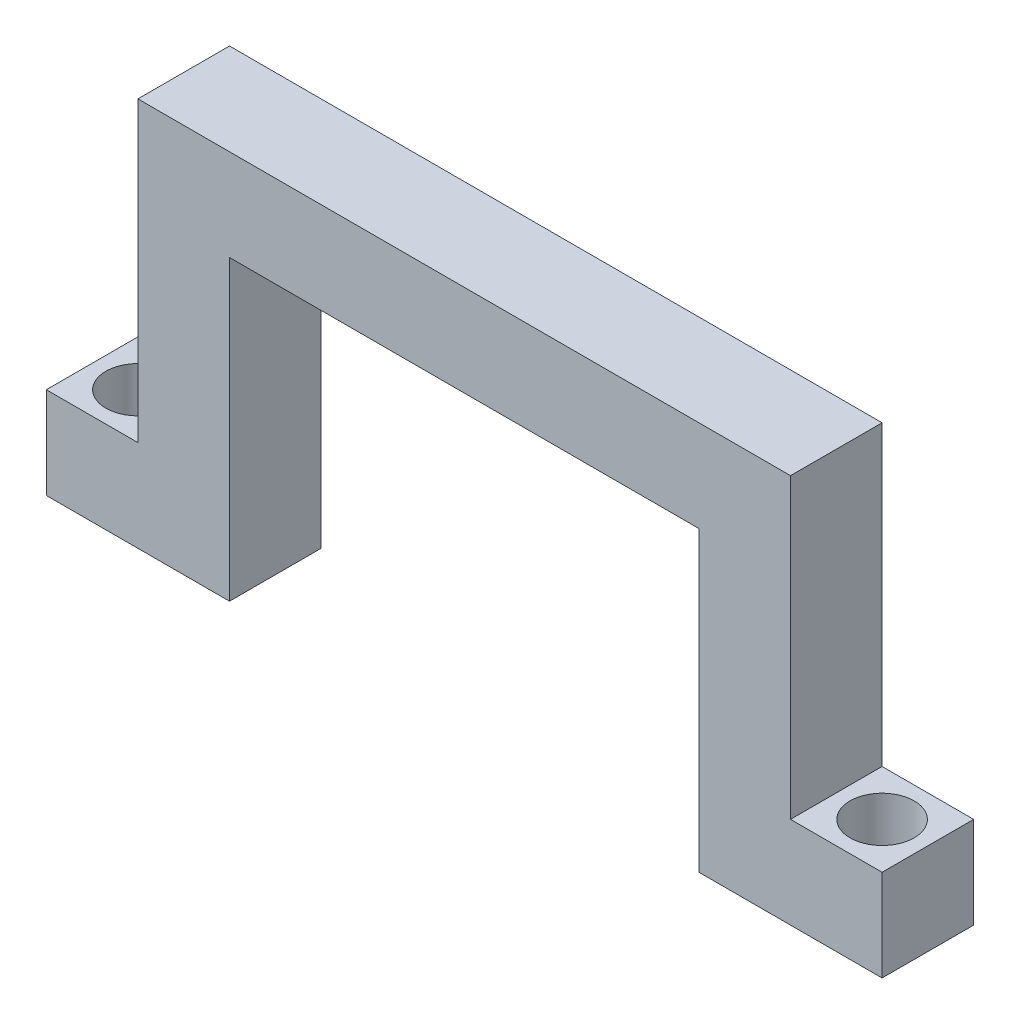
ISO-10303-21;
HEADER;
FILE_DESCRIPTION(('STEP AP214'),'2;1');
FILE_NAME('part.step','',(''),(''),'','','');
FILE_SCHEMA(('AUTOMOTIVE_DESIGN { 1 0 10303 214 1 1 1 1 }'));
ENDSEC;
DATA;
#1=APPLICATION_CONTEXT('core data for automotive mechanical design processes');
#2=APPLICATION_PROTOCOL_DEFINITION('international standard','automotive_design',2000,#1);
#3=PRODUCT_CONTEXT('',#1,'mechanical');
#4=PRODUCT('Part','Part','',(#3));
#5=PRODUCT_RELATED_PRODUCT_CATEGORY('part','',(#4));
#6=PRODUCT_DEFINITION_FORMATION('','',#4);
#7=PRODUCT_DEFINITION_CONTEXT('part definition',#1,'design');
#8=PRODUCT_DEFINITION('design','',#6,#7);
#9=PRODUCT_DEFINITION_SHAPE('','',#8);
#10=(LENGTH_UNIT() NAMED_UNIT(*) SI_UNIT(.MILLI.,.METRE.));
#11=(NAMED_UNIT(*) PLANE_ANGLE_UNIT() SI_UNIT($,.RADIAN.));
#12=(NAMED_UNIT(*) SI_UNIT($,.STERADIAN.) SOLID_ANGLE_UNIT());
#13=UNCERTAINTY_MEASURE_WITH_UNIT(LENGTH_MEASURE(1.E-05),#10,'distance_accuracy_value','');
#14=(GEOMETRIC_REPRESENTATION_CONTEXT(3) GLOBAL_UNCERTAINTY_ASSIGNED_CONTEXT((#13)) GLOBAL_UNIT_ASSIGNED_CONTEXT((#10,
#11,#12)) REPRESENTATION_CONTEXT('',''));
#15=CARTESIAN_POINT('',(0.,0.,0.));
#16=DIRECTION('',(0.,0.,1.));
#17=DIRECTION('',(1.,0.,0.));
#18=AXIS2_PLACEMENT_3D('',#15,#16,#17);
#19=CARTESIAN_POINT('',(13.4215909090909,21.59,0.));
#20=DIRECTION('',(-1.,0.,0.));
#21=DIRECTION('',(0.,0.,1.));
#22=AXIS2_PLACEMENT_3D('',#19,#20,#21);
#23=PLANE('',#22);
#24=DIRECTION('',(0.,0.,1.));
#25=VECTOR('',#24,1.);
#26=CARTESIAN_POINT('',(13.4215909090909,5.08,0.));
#27=LINE('',#26,#25);
#28=CARTESIAN_POINT('',(13.4215909090909,5.08,0.));
#29=VERTEX_POINT('',#28);
#30=CARTESIAN_POINT('',(13.4215909090909,5.08,5.08));
#31=VERTEX_POINT('',#30);
#32=EDGE_CURVE('E50',#29,#31,#27,.T.);
#33=ORIENTED_EDGE('',*,*,#32,.F.);
#34=DIRECTION('',(0.,-1.,0.));
#35=VECTOR('',#34,1.);
#36=CARTESIAN_POINT('',(13.4215909090909,21.59,0.));
#37=LINE('',#36,#35);
#38=CARTESIAN_POINT('',(13.4215909090909,21.59,0.));
#39=VERTEX_POINT('',#38);
#40=EDGE_CURVE('E212',#39,#29,#37,.T.);
#41=ORIENTED_EDGE('',*,*,#40,.F.);
#42=DIRECTION('',(0.,0.,-1.));
#43=VECTOR('',#42,1.);
#44=CARTESIAN_POINT('',(13.4215909090909,21.59,0.));
#45=LINE('',#44,#43);
#46=CARTESIAN_POINT('',(13.4215909090909,21.59,5.08));
#47=VERTEX_POINT('',#46);
#48=EDGE_CURVE('E202',#47,#39,#45,.T.);
#49=ORIENTED_EDGE('',*,*,#48,.F.);
#50=DIRECTION('',(0.,-1.,0.));
#51=VECTOR('',#50,1.);
#52=CARTESIAN_POINT('',(13.4215909090909,21.59,5.08));
#53=LINE('',#52,#51);
#54=EDGE_CURVE('E214',#47,#31,#53,.T.);
#55=ORIENTED_EDGE('',*,*,#54,.T.);
#56=EDGE_LOOP('',(#33,#41,#49,#55));
#57=FACE_BOUND('',#56,.T.);
#58=ADVANCED_FACE('F33',(#57),#23,.F.);
#59=CARTESIAN_POINT('',(0.,0.,0.));
#60=DIRECTION('',(0.,1.,0.));
#61=DIRECTION('',(0.,0.,1.));
#62=AXIS2_PLACEMENT_3D('',#59,#60,#61);
#63=PLANE('',#62);
#64=CARTESIAN_POINT('',(15.9615909090909,0.,2.54));
#65=DIRECTION('',(0.,1.,0.));
#66=DIRECTION('',(0.,0.,-1.));
#67=AXIS2_PLACEMENT_3D('',#64,#65,#66);
#68=CIRCLE('',#67,1.778);
#69=CARTESIAN_POINT('',(15.9615909090909,0.,0.762000000000001));
#70=VERTEX_POINT('',#69);
#71=EDGE_CURVE('E226',#70,#70,#68,.T.);
#72=ORIENTED_EDGE('',*,*,#71,.T.);
#73=EDGE_LOOP('',(#72));
#74=FACE_BOUND('',#73,.T.);
#75=DIRECTION('',(0.,0.,1.));
#76=VECTOR('',#75,1.);
#77=CARTESIAN_POINT('',(8.34159090909091,0.,0.));
#78=LINE('',#77,#76);
#79=CARTESIAN_POINT('',(8.34159090909091,0.,0.));
#80=VERTEX_POINT('',#79);
#81=CARTESIAN_POINT('',(8.34159090909091,0.,5.08));
#82=VERTEX_POINT('',#81);
#83=EDGE_CURVE('E42',#80,#82,#78,.T.);
#84=ORIENTED_EDGE('',*,*,#83,.F.);
#85=DIRECTION('',(-1.,0.,0.));
#86=VECTOR('',#85,1.);
#87=CARTESIAN_POINT('',(-22.7734090909091,0.,0.));
#88=LINE('',#87,#86);
#89=CARTESIAN_POINT('',(18.5015909090909,0.,0.));
#90=VERTEX_POINT('',#89);
#91=EDGE_CURVE('E127',#90,#80,#88,.T.);
#92=ORIENTED_EDGE('',*,*,#91,.F.);
#93=DIRECTION('',(0.,0.,1.));
#94=VECTOR('',#93,1.);
#95=CARTESIAN_POINT('',(18.5015909090909,0.,0.));
#96=LINE('',#95,#94);
#97=CARTESIAN_POINT('',(18.5015909090909,0.,5.08));
#98=VERTEX_POINT('',#97);
#99=EDGE_CURVE('E132',#90,#98,#96,.T.);
#100=ORIENTED_EDGE('',*,*,#99,.T.);
#101=DIRECTION('',(1.,0.,0.));
#102=VECTOR('',#101,1.);
#103=CARTESIAN_POINT('',(-22.7734090909091,0.,5.08));
#104=LINE('',#103,#102);
#105=EDGE_CURVE('E197',#82,#98,#104,.T.);
#106=ORIENTED_EDGE('',*,*,#105,.F.);
#107=EDGE_LOOP('',(#84,#92,#100,#106));
#108=FACE_BOUND('',#107,.T.);
#109=ADVANCED_FACE('F129',(#74,#108),#63,.F.);
#110=CARTESIAN_POINT('',(-22.7734090909091,21.59,0.));
#111=DIRECTION('',(1.,0.,0.));
#112=DIRECTION('',(0.,0.,-1.));
#113=AXIS2_PLACEMENT_3D('',#110,#111,#112);
#114=PLANE('',#113);
#115=DIRECTION('',(0.,-1.,0.));
#116=VECTOR('',#115,1.);
#117=CARTESIAN_POINT('',(-22.7734090909091,21.59,0.));
#118=LINE('',#117,#116);
#119=CARTESIAN_POINT('',(-22.7734090909091,21.59,0.));
#120=VERTEX_POINT('',#119);
#121=CARTESIAN_POINT('',(-22.7734090909091,5.08,0.));
#122=VERTEX_POINT('',#121);
#123=EDGE_CURVE('E206',#120,#122,#118,.T.);
#124=ORIENTED_EDGE('',*,*,#123,.T.);
#125=DIRECTION('',(0.,0.,1.));
#126=VECTOR('',#125,1.);
#127=CARTESIAN_POINT('',(-22.7734090909091,5.08,0.));
#128=LINE('',#127,#126);
#129=CARTESIAN_POINT('',(-22.7734090909091,5.08,5.08));
#130=VERTEX_POINT('',#129);
#131=EDGE_CURVE('E169',#122,#130,#128,.T.);
#132=ORIENTED_EDGE('',*,*,#131,.T.);
#133=DIRECTION('',(0.,-1.,0.));
#134=VECTOR('',#133,1.);
#135=CARTESIAN_POINT('',(-22.7734090909091,21.59,5.08));
#136=LINE('',#135,#134);
#137=CARTESIAN_POINT('',(-22.7734090909091,21.59,5.08));
#138=VERTEX_POINT('',#137);
#139=EDGE_CURVE('E216',#138,#130,#136,.T.);
#140=ORIENTED_EDGE('',*,*,#139,.F.);
#141=DIRECTION('',(0.,0.,1.));
#142=VECTOR('',#141,1.);
#143=CARTESIAN_POINT('',(-22.7734090909091,21.59,0.));
#144=LINE('',#143,#142);
#145=EDGE_CURVE('E135',#120,#138,#144,.T.);
#146=ORIENTED_EDGE('',*,*,#145,.F.);
#147=EDGE_LOOP('',(#124,#132,#140,#146));
#148=FACE_BOUND('',#147,.T.);
#149=ADVANCED_FACE('F35',(#148),#114,.F.);
#150=CARTESIAN_POINT('',(-22.7734090909091,21.59,5.08));
#151=DIRECTION('',(0.,0.,-1.));
#152=DIRECTION('',(-1.,0.,0.));
#153=AXIS2_PLACEMENT_3D('',#150,#151,#152);
#154=PLANE('',#153);
#155=CARTESIAN_POINT('',(-27.8534090909091,0.,5.08));
#156=VERTEX_POINT('',#155);
#157=CARTESIAN_POINT('',(-17.6934090909091,0.,5.08));
#158=VERTEX_POINT('',#157);
#159=EDGE_CURVE('E207',#156,#158,#104,.T.);
#160=ORIENTED_EDGE('',*,*,#159,.T.);
#161=DIRECTION('',(0.,1.,0.));
#162=VECTOR('',#161,1.);
#163=CARTESIAN_POINT('',(-17.6934090909091,21.59,5.08));
#164=LINE('',#163,#162);
#165=CARTESIAN_POINT('',(-17.6934090909091,16.51,5.08));
#166=VERTEX_POINT('',#165);
#167=EDGE_CURVE('E191',#158,#166,#164,.T.);
#168=ORIENTED_EDGE('',*,*,#167,.T.);
#169=DIRECTION('',(1.,0.,0.));
#170=VECTOR('',#169,1.);
#171=CARTESIAN_POINT('',(-22.7734090909091,16.51,5.08));
#172=LINE('',#171,#170);
#173=CARTESIAN_POINT('',(8.34159090909091,16.51,5.08));
#174=VERTEX_POINT('',#173);
#175=EDGE_CURVE('E194',#166,#174,#172,.T.);
#176=ORIENTED_EDGE('',*,*,#175,.T.);
#177=DIRECTION('',(0.,1.,0.));
#178=VECTOR('',#177,1.);
#179=CARTESIAN_POINT('',(8.34159090909091,21.59,5.08));
#180=LINE('',#179,#178);
#181=EDGE_CURVE('E188',#82,#174,#180,.T.);
#182=ORIENTED_EDGE('',*,*,#181,.F.);
#183=ORIENTED_EDGE('',*,*,#105,.T.);
#184=DIRECTION('',(0.,-1.,0.));
#185=VECTOR('',#184,1.);
#186=CARTESIAN_POINT('',(18.5015909090909,5.08,5.08));
#187=LINE('',#186,#185);
#188=CARTESIAN_POINT('',(18.5015909090909,5.08,5.08));
#189=VERTEX_POINT('',#188);
#190=EDGE_CURVE('E147',#189,#98,#187,.T.);
#191=ORIENTED_EDGE('',*,*,#190,.F.);
#192=DIRECTION('',(1.,0.,0.));
#193=VECTOR('',#192,1.);
#194=CARTESIAN_POINT('',(13.4215909090909,5.08,5.08));
#195=LINE('',#194,#193);
#196=EDGE_CURVE('E156',#31,#189,#195,.T.);
#197=ORIENTED_EDGE('',*,*,#196,.F.);
#198=ORIENTED_EDGE('',*,*,#54,.F.);
#199=DIRECTION('',(1.,0.,0.));
#200=VECTOR('',#199,1.);
#201=CARTESIAN_POINT('',(-22.7734090909091,21.59,5.08));
#202=LINE('',#201,#200);
#203=EDGE_CURVE('E200',#138,#47,#202,.T.);
#204=ORIENTED_EDGE('',*,*,#203,.F.);
#205=ORIENTED_EDGE('',*,*,#139,.T.);
#206=DIRECTION('',(-1.,0.,0.));
#207=VECTOR('',#206,1.);
#208=CARTESIAN_POINT('',(-22.7734090909091,5.08,5.08));
#209=LINE('',#208,#207);
#210=CARTESIAN_POINT('',(-27.8534090909091,5.08,5.08));
#211=VERTEX_POINT('',#210);
#212=EDGE_CURVE('E58',#130,#211,#209,.T.);
#213=ORIENTED_EDGE('',*,*,#212,.T.);
#214=DIRECTION('',(0.,-1.,0.));
#215=VECTOR('',#214,1.);
#216=CARTESIAN_POINT('',(-27.8534090909091,5.08,5.08));
#217=LINE('',#216,#215);
#218=EDGE_CURVE('E170',#211,#156,#217,.T.);
#219=ORIENTED_EDGE('',*,*,#218,.T.);
#220=EDGE_LOOP('',(#160,#168,#176,#182,#183,#191,#197,#198,#204,#205,#213,#219));
#221=FACE_BOUND('',#220,.T.);
#222=ADVANCED_FACE('F257',(#221),#154,.F.);
#223=CARTESIAN_POINT('',(-22.7734090909091,21.59,0.));
#224=DIRECTION('',(0.,0.,1.));
#225=DIRECTION('',(1.,0.,0.));
#226=AXIS2_PLACEMENT_3D('',#223,#224,#225);
#227=PLANE('',#226);
#228=DIRECTION('',(1.,0.,0.));
#229=VECTOR('',#228,1.);
#230=CARTESIAN_POINT('',(-17.6934090909091,16.51,0.));
#231=LINE('',#230,#229);
#232=CARTESIAN_POINT('',(-17.6934090909091,16.51,0.));
#233=VERTEX_POINT('',#232);
#234=CARTESIAN_POINT('',(8.34159090909091,16.51,0.));
#235=VERTEX_POINT('',#234);
#236=EDGE_CURVE('E175',#233,#235,#231,.T.);
#237=ORIENTED_EDGE('',*,*,#236,.F.);
#238=DIRECTION('',(0.,1.,0.));
#239=VECTOR('',#238,1.);
#240=CARTESIAN_POINT('',(-17.6934090909091,0.,0.));
#241=LINE('',#240,#239);
#242=CARTESIAN_POINT('',(-17.6934090909091,0.,0.));
#243=VERTEX_POINT('',#242);
#244=EDGE_CURVE('E182',#243,#233,#241,.T.);
#245=ORIENTED_EDGE('',*,*,#244,.F.);
#246=CARTESIAN_POINT('',(-27.8534090909091,0.,0.));
#247=VERTEX_POINT('',#246);
#248=EDGE_CURVE('E136',#243,#247,#88,.T.);
#249=ORIENTED_EDGE('',*,*,#248,.T.);
#250=DIRECTION('',(0.,-1.,0.));
#251=VECTOR('',#250,1.);
#252=CARTESIAN_POINT('',(-27.8534090909091,5.08,0.));
#253=LINE('',#252,#251);
#254=CARTESIAN_POINT('',(-27.8534090909091,5.08,0.));
#255=VERTEX_POINT('',#254);
#256=EDGE_CURVE('E172',#255,#247,#253,.T.);
#257=ORIENTED_EDGE('',*,*,#256,.F.);
#258=DIRECTION('',(-1.,0.,0.));
#259=VECTOR('',#258,1.);
#260=CARTESIAN_POINT('',(-22.7734090909091,5.08,0.));
#261=LINE('',#260,#259);
#262=EDGE_CURVE('E167',#122,#255,#261,.T.);
#263=ORIENTED_EDGE('',*,*,#262,.F.);
#264=ORIENTED_EDGE('',*,*,#123,.F.);
#265=DIRECTION('',(-1.,0.,0.));
#266=VECTOR('',#265,1.);
#267=CARTESIAN_POINT('',(-22.7734090909091,21.59,0.));
#268=LINE('',#267,#266);
#269=EDGE_CURVE('E204',#39,#120,#268,.T.);
#270=ORIENTED_EDGE('',*,*,#269,.F.);
#271=ORIENTED_EDGE('',*,*,#40,.T.);
#272=DIRECTION('',(1.,0.,0.));
#273=VECTOR('',#272,1.);
#274=CARTESIAN_POINT('',(13.4215909090909,5.08,0.));
#275=LINE('',#274,#273);
#276=CARTESIAN_POINT('',(18.5015909090909,5.08,0.));
#277=VERTEX_POINT('',#276);
#278=EDGE_CURVE('E143',#29,#277,#275,.T.);
#279=ORIENTED_EDGE('',*,*,#278,.T.);
#280=DIRECTION('',(0.,-1.,0.));
#281=VECTOR('',#280,1.);
#282=CARTESIAN_POINT('',(18.5015909090909,5.08,0.));
#283=LINE('',#282,#281);
#284=EDGE_CURVE('E139',#277,#90,#283,.T.);
#285=ORIENTED_EDGE('',*,*,#284,.T.);
#286=ORIENTED_EDGE('',*,*,#91,.T.);
#287=DIRECTION('',(0.,1.,0.));
#288=VECTOR('',#287,1.);
#289=CARTESIAN_POINT('',(8.34159090909091,0.,0.));
#290=LINE('',#289,#288);
#291=EDGE_CURVE('E180',#80,#235,#290,.T.);
#292=ORIENTED_EDGE('',*,*,#291,.T.);
#293=EDGE_LOOP('',(#237,#245,#249,#257,#263,#264,#270,#271,#279,#285,#286,#292));
#294=FACE_BOUND('',#293,.T.);
#295=ADVANCED_FACE('F141',(#294),#227,.F.);
#296=CARTESIAN_POINT('',(0.,21.59,0.));
#297=DIRECTION('',(0.,1.,0.));
#298=DIRECTION('',(0.,0.,1.));
#299=AXIS2_PLACEMENT_3D('',#296,#297,#298);
#300=PLANE('',#299);
#301=ORIENTED_EDGE('',*,*,#145,.T.);
#302=ORIENTED_EDGE('',*,*,#203,.T.);
#303=ORIENTED_EDGE('',*,*,#48,.T.);
#304=ORIENTED_EDGE('',*,*,#269,.T.);
#305=EDGE_LOOP('',(#301,#302,#303,#304));
#306=FACE_BOUND('',#305,.T.);
#307=ADVANCED_FACE('F264',(#306),#300,.T.);
#308=CARTESIAN_POINT('',(-25.3134090909091,0.,2.54));
#309=DIRECTION('',(0.,1.,0.));
#310=DIRECTION('',(0.,0.,1.));
#311=AXIS2_PLACEMENT_3D('',#308,#309,#310);
#312=CIRCLE('',#311,1.778);
#313=CARTESIAN_POINT('',(-25.3134090909091,0.,4.318));
#314=VERTEX_POINT('',#313);
#315=EDGE_CURVE('E221',#314,#314,#312,.T.);
#316=ORIENTED_EDGE('',*,*,#315,.T.);
#317=EDGE_LOOP('',(#316));
#318=FACE_BOUND('',#317,.T.);
#319=ORIENTED_EDGE('',*,*,#248,.F.);
#320=DIRECTION('',(0.,0.,1.));
#321=VECTOR('',#320,1.);
#322=CARTESIAN_POINT('',(-17.6934090909091,0.,0.));
#323=LINE('',#322,#321);
#324=EDGE_CURVE('E11',#243,#158,#323,.T.);
#325=ORIENTED_EDGE('',*,*,#324,.T.);
#326=ORIENTED_EDGE('',*,*,#159,.F.);
#327=DIRECTION('',(0.,0.,1.));
#328=VECTOR('',#327,1.);
#329=CARTESIAN_POINT('',(-27.8534090909091,0.,0.));
#330=LINE('',#329,#328);
#331=EDGE_CURVE('E152',#247,#156,#330,.T.);
#332=ORIENTED_EDGE('',*,*,#331,.F.);
#333=EDGE_LOOP('',(#319,#325,#326,#332));
#334=FACE_BOUND('',#333,.T.);
#335=ADVANCED_FACE('F255',(#318,#334),#63,.F.);
#336=CARTESIAN_POINT('',(-17.6934090909091,16.51,16.51));
#337=DIRECTION('',(0.,1.,0.));
#338=DIRECTION('',(0.,0.,1.));
#339=AXIS2_PLACEMENT_3D('',#336,#337,#338);
#340=PLANE('',#339);
#341=DIRECTION('',(0.,0.,-1.));
#342=VECTOR('',#341,1.);
#343=CARTESIAN_POINT('',(-17.6934090909091,16.51,16.51));
#344=LINE('',#343,#342);
#345=EDGE_CURVE('E186',#166,#233,#344,.T.);
#346=ORIENTED_EDGE('',*,*,#345,.T.);
#347=ORIENTED_EDGE('',*,*,#236,.T.);
#348=DIRECTION('',(0.,0.,-1.));
#349=VECTOR('',#348,1.);
#350=CARTESIAN_POINT('',(8.34159090909091,16.51,16.51));
#351=LINE('',#350,#349);
#352=EDGE_CURVE('E185',#174,#235,#351,.T.);
#353=ORIENTED_EDGE('',*,*,#352,.F.);
#354=ORIENTED_EDGE('',*,*,#175,.F.);
#355=EDGE_LOOP('',(#346,#347,#353,#354));
#356=FACE_BOUND('',#355,.T.);
#357=ADVANCED_FACE('F277',(#356),#340,.F.);
#358=CARTESIAN_POINT('',(-17.6934090909091,0.,16.51));
#359=DIRECTION('',(-1.,0.,0.));
#360=DIRECTION('',(0.,0.,1.));
#361=AXIS2_PLACEMENT_3D('',#358,#359,#360);
#362=PLANE('',#361);
#363=ORIENTED_EDGE('',*,*,#324,.F.);
#364=ORIENTED_EDGE('',*,*,#244,.T.);
#365=ORIENTED_EDGE('',*,*,#345,.F.);
#366=ORIENTED_EDGE('',*,*,#167,.F.);
#367=EDGE_LOOP('',(#363,#364,#365,#366));
#368=FACE_BOUND('',#367,.T.);
#369=ADVANCED_FACE('F272',(#368),#362,.F.);
#370=CARTESIAN_POINT('',(8.34159090909091,0.,16.51));
#371=DIRECTION('',(-1.,0.,0.));
#372=DIRECTION('',(0.,0.,1.));
#373=AXIS2_PLACEMENT_3D('',#370,#371,#372);
#374=PLANE('',#373);
#375=ORIENTED_EDGE('',*,*,#181,.T.);
#376=ORIENTED_EDGE('',*,*,#352,.T.);
#377=ORIENTED_EDGE('',*,*,#291,.F.);
#378=ORIENTED_EDGE('',*,*,#83,.T.);
#379=EDGE_LOOP('',(#375,#376,#377,#378));
#380=FACE_BOUND('',#379,.T.);
#381=ADVANCED_FACE('F280',(#380),#374,.T.);
#382=CARTESIAN_POINT('',(-27.8534090909091,5.08,0.));
#383=DIRECTION('',(1.,0.,0.));
#384=DIRECTION('',(0.,0.,-1.));
#385=AXIS2_PLACEMENT_3D('',#382,#383,#384);
#386=PLANE('',#385);
#387=ORIENTED_EDGE('',*,*,#331,.T.);
#388=ORIENTED_EDGE('',*,*,#218,.F.);
#389=DIRECTION('',(0.,0.,1.));
#390=VECTOR('',#389,1.);
#391=CARTESIAN_POINT('',(-27.8534090909091,5.08,0.));
#392=LINE('',#391,#390);
#393=EDGE_CURVE('E165',#255,#211,#392,.T.);
#394=ORIENTED_EDGE('',*,*,#393,.F.);
#395=ORIENTED_EDGE('',*,*,#256,.T.);
#396=EDGE_LOOP('',(#387,#388,#394,#395));
#397=FACE_BOUND('',#396,.T.);
#398=ADVANCED_FACE('F282',(#397),#386,.F.);
#399=CARTESIAN_POINT('',(0.,5.08,0.));
#400=DIRECTION('',(0.,1.,0.));
#401=DIRECTION('',(0.,0.,1.));
#402=AXIS2_PLACEMENT_3D('',#399,#400,#401);
#403=PLANE('',#402);
#404=CARTESIAN_POINT('',(-25.3134090909091,5.08,2.54));
#405=DIRECTION('',(0.,1.,0.));
#406=DIRECTION('',(0.,0.,1.));
#407=AXIS2_PLACEMENT_3D('',#404,#405,#406);
#408=CIRCLE('',#407,1.778);
#409=CARTESIAN_POINT('',(-25.3134090909091,5.08,4.318));
#410=VERTEX_POINT('',#409);
#411=EDGE_CURVE('E37',#410,#410,#408,.F.);
#412=ORIENTED_EDGE('',*,*,#411,.T.);
#413=EDGE_LOOP('',(#412));
#414=FACE_BOUND('',#413,.T.);
#415=ORIENTED_EDGE('',*,*,#212,.F.);
#416=ORIENTED_EDGE('',*,*,#131,.F.);
#417=ORIENTED_EDGE('',*,*,#262,.T.);
#418=ORIENTED_EDGE('',*,*,#393,.T.);
#419=EDGE_LOOP('',(#415,#416,#417,#418));
#420=FACE_BOUND('',#419,.T.);
#421=ADVANCED_FACE('F288',(#414,#420),#403,.T.);
#422=CARTESIAN_POINT('',(18.5015909090909,5.08,0.));
#423=DIRECTION('',(1.,0.,0.));
#424=DIRECTION('',(0.,0.,-1.));
#425=AXIS2_PLACEMENT_3D('',#422,#423,#424);
#426=PLANE('',#425);
#427=ORIENTED_EDGE('',*,*,#99,.F.);
#428=ORIENTED_EDGE('',*,*,#284,.F.);
#429=DIRECTION('',(0.,0.,1.));
#430=VECTOR('',#429,1.);
#431=CARTESIAN_POINT('',(18.5015909090909,5.08,0.));
#432=LINE('',#431,#430);
#433=EDGE_CURVE('E161',#277,#189,#432,.T.);
#434=ORIENTED_EDGE('',*,*,#433,.T.);
#435=ORIENTED_EDGE('',*,*,#190,.T.);
#436=EDGE_LOOP('',(#427,#428,#434,#435));
#437=FACE_BOUND('',#436,.T.);
#438=ADVANCED_FACE('F150',(#437),#426,.T.);
#439=CARTESIAN_POINT('',(0.,5.08,0.));
#440=DIRECTION('',(0.,1.,0.));
#441=DIRECTION('',(0.,0.,1.));
#442=AXIS2_PLACEMENT_3D('',#439,#440,#441);
#443=PLANE('',#442);
#444=CARTESIAN_POINT('',(15.9615909090909,5.08,2.54));
#445=DIRECTION('',(0.,1.,0.));
#446=DIRECTION('',(0.,0.,1.));
#447=AXIS2_PLACEMENT_3D('',#444,#445,#446);
#448=CIRCLE('',#447,1.778);
#449=CARTESIAN_POINT('',(15.9615909090909,5.08,4.318));
#450=VERTEX_POINT('',#449);
#451=EDGE_CURVE('E219',#450,#450,#448,.F.);
#452=ORIENTED_EDGE('',*,*,#451,.T.);
#453=EDGE_LOOP('',(#452));
#454=FACE_BOUND('',#453,.T.);
#455=ORIENTED_EDGE('',*,*,#32,.T.);
#456=ORIENTED_EDGE('',*,*,#196,.T.);
#457=ORIENTED_EDGE('',*,*,#433,.F.);
#458=ORIENTED_EDGE('',*,*,#278,.F.);
#459=EDGE_LOOP('',(#455,#456,#457,#458));
#460=FACE_BOUND('',#459,.T.);
#461=ADVANCED_FACE('F238',(#454,#460),#443,.T.);
#462=CARTESIAN_POINT('',(15.9615909090909,9.144,2.54));
#463=DIRECTION('',(0.,-1.,0.));
#464=DIRECTION('',(0.,0.,-1.));
#465=AXIS2_PLACEMENT_3D('',#462,#463,#464);
#466=CYLINDRICAL_SURFACE('',#465,1.778);
#467=ORIENTED_EDGE('',*,*,#451,.F.);
#468=EDGE_LOOP('',(#467));
#469=FACE_BOUND('',#468,.T.);
#470=ORIENTED_EDGE('',*,*,#71,.F.);
#471=EDGE_LOOP('',(#470));
#472=FACE_BOUND('',#471,.T.);
#473=ADVANCED_FACE('F235',(#469,#472),#466,.F.);
#474=CARTESIAN_POINT('',(-25.3134090909091,9.144,2.54));
#475=DIRECTION('',(0.,-1.,0.));
#476=DIRECTION('',(0.,0.,-1.));
#477=AXIS2_PLACEMENT_3D('',#474,#475,#476);
#478=CYLINDRICAL_SURFACE('',#477,1.778);
#479=ORIENTED_EDGE('',*,*,#411,.F.);
#480=EDGE_LOOP('',(#479));
#481=FACE_BOUND('',#480,.T.);
#482=ORIENTED_EDGE('',*,*,#315,.F.);
#483=EDGE_LOOP('',(#482));
#484=FACE_BOUND('',#483,.T.);
#485=ADVANCED_FACE('F237',(#481,#484),#478,.F.);
#486=CLOSED_SHELL('',(#58,#109,#149,#222,#295,#307,#335,#357,#369,#381,#398,#421,#438,#461,#473,#485));
#487=MANIFOLD_SOLID_BREP('B2',#486);
#488=ADVANCED_BREP_SHAPE_REPRESENTATION('',(#18,#487),#14);
#489=SHAPE_DEFINITION_REPRESENTATION(#9,#488);
ENDSEC;
END-ISO-10303-21;
